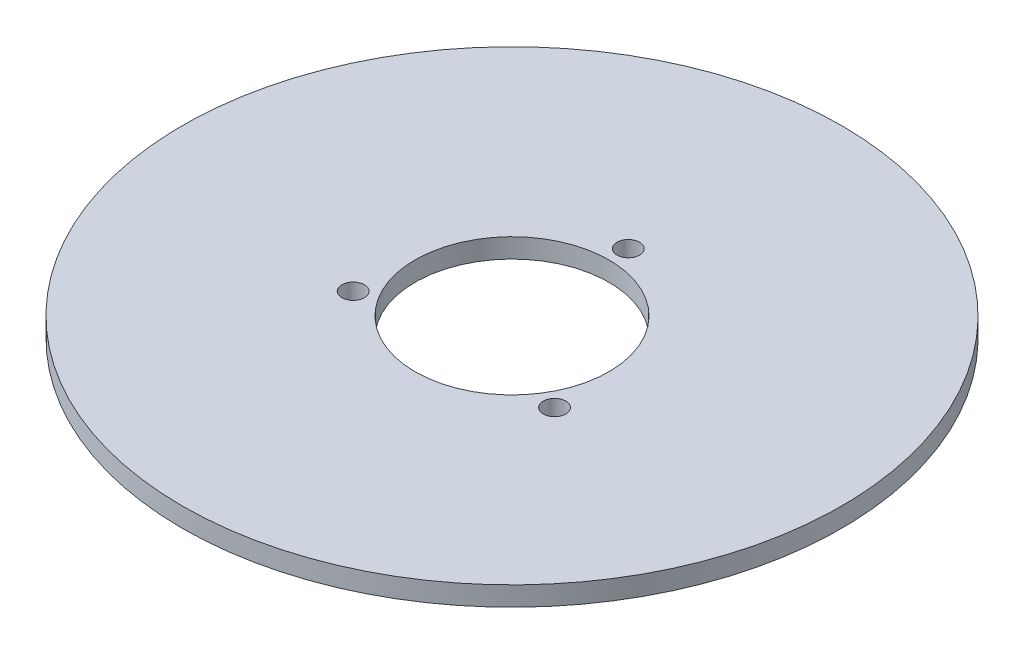
ISO-10303-21;
HEADER;
FILE_DESCRIPTION(('STEP AP214'),'2;1');
FILE_NAME('part.step','',(''),(''),'','','');
FILE_SCHEMA(('AUTOMOTIVE_DESIGN { 1 0 10303 214 1 1 1 1 }'));
ENDSEC;
DATA;
#1=APPLICATION_CONTEXT('core data for automotive mechanical design processes');
#2=APPLICATION_PROTOCOL_DEFINITION('international standard','automotive_design',2000,#1);
#3=PRODUCT_CONTEXT('',#1,'mechanical');
#4=PRODUCT('Part','Part','',(#3));
#5=PRODUCT_RELATED_PRODUCT_CATEGORY('part','',(#4));
#6=PRODUCT_DEFINITION_FORMATION('','',#4);
#7=PRODUCT_DEFINITION_CONTEXT('part definition',#1,'design');
#8=PRODUCT_DEFINITION('design','',#6,#7);
#9=PRODUCT_DEFINITION_SHAPE('','',#8);
#10=(LENGTH_UNIT() NAMED_UNIT(*) SI_UNIT(.MILLI.,.METRE.));
#11=(NAMED_UNIT(*) PLANE_ANGLE_UNIT() SI_UNIT($,.RADIAN.));
#12=(NAMED_UNIT(*) SI_UNIT($,.STERADIAN.) SOLID_ANGLE_UNIT());
#13=UNCERTAINTY_MEASURE_WITH_UNIT(LENGTH_MEASURE(1.E-05),#10,'distance_accuracy_value','');
#14=(GEOMETRIC_REPRESENTATION_CONTEXT(3) GLOBAL_UNCERTAINTY_ASSIGNED_CONTEXT((#13)) GLOBAL_UNIT_ASSIGNED_CONTEXT((#10,
#11,#12)) REPRESENTATION_CONTEXT('',''));
#15=CARTESIAN_POINT('',(0.,0.,0.));
#16=DIRECTION('',(0.,0.,1.));
#17=DIRECTION('',(1.,0.,0.));
#18=AXIS2_PLACEMENT_3D('',#15,#16,#17);
#19=CARTESIAN_POINT('',(0.,5.,0.));
#20=DIRECTION('',(0.,1.,0.));
#21=DIRECTION('',(0.,0.,1.));
#22=AXIS2_PLACEMENT_3D('',#19,#20,#21);
#23=PLANE('',#22);
#24=CARTESIAN_POINT('',(-25.9807621135332,5.,15.));
#25=DIRECTION('',(0.,1.,0.));
#26=DIRECTION('',(0.,0.,1.));
#27=AXIS2_PLACEMENT_3D('',#24,#25,#26);
#28=CIRCLE('',#27,2.9);
#29=CARTESIAN_POINT('',(-25.9807621135332,5.,17.9));
#30=VERTEX_POINT('',#29);
#31=EDGE_CURVE('E62',#30,#30,#28,.T.);
#32=ORIENTED_EDGE('',*,*,#31,.F.);
#33=EDGE_LOOP('',(#32));
#34=FACE_BOUND('',#33,.T.);
#35=CARTESIAN_POINT('',(0.,5.,-30.));
#36=DIRECTION('',(0.,1.,0.));
#37=DIRECTION('',(0.,0.,1.));
#38=AXIS2_PLACEMENT_3D('',#35,#36,#37);
#39=CIRCLE('',#38,2.9);
#40=CARTESIAN_POINT('',(0.,5.,-27.1));
#41=VERTEX_POINT('',#40);
#42=EDGE_CURVE('E51',#41,#41,#39,.T.);
#43=ORIENTED_EDGE('',*,*,#42,.F.);
#44=EDGE_LOOP('',(#43));
#45=FACE_BOUND('',#44,.T.);
#46=CARTESIAN_POINT('',(0.,5.,0.));
#47=DIRECTION('',(0.,1.,0.));
#48=DIRECTION('',(0.,0.,1.));
#49=AXIS2_PLACEMENT_3D('',#46,#47,#48);
#50=CIRCLE('',#49,85.);
#51=CARTESIAN_POINT('',(0.,5.,85.));
#52=VERTEX_POINT('',#51);
#53=EDGE_CURVE('E12',#52,#52,#50,.T.);
#54=ORIENTED_EDGE('',*,*,#53,.T.);
#55=EDGE_LOOP('',(#54));
#56=FACE_BOUND('',#55,.T.);
#57=CARTESIAN_POINT('',(25.9807621135332,5.,15.));
#58=DIRECTION('',(0.,1.,0.));
#59=DIRECTION('',(0.,0.,1.));
#60=AXIS2_PLACEMENT_3D('',#57,#58,#59);
#61=CIRCLE('',#60,2.9);
#62=CARTESIAN_POINT('',(25.9807621135332,5.,17.9));
#63=VERTEX_POINT('',#62);
#64=EDGE_CURVE('E56',#63,#63,#61,.T.);
#65=ORIENTED_EDGE('',*,*,#64,.F.);
#66=EDGE_LOOP('',(#65));
#67=FACE_BOUND('',#66,.T.);
#68=CARTESIAN_POINT('',(0.,5.,0.));
#69=DIRECTION('',(0.,1.,0.));
#70=DIRECTION('',(0.,0.,1.));
#71=AXIS2_PLACEMENT_3D('',#68,#69,#70);
#72=CIRCLE('',#71,25.);
#73=CARTESIAN_POINT('',(0.,5.,25.));
#74=VERTEX_POINT('',#73);
#75=EDGE_CURVE('E68',#74,#74,#72,.T.);
#76=ORIENTED_EDGE('',*,*,#75,.F.);
#77=EDGE_LOOP('',(#76));
#78=FACE_BOUND('',#77,.T.);
#79=ADVANCED_FACE('F40',(#34,#45,#56,#67,#78),#23,.T.);
#80=CARTESIAN_POINT('',(0.,0.,0.));
#81=DIRECTION('',(0.,1.,0.));
#82=DIRECTION('',(0.,0.,1.));
#83=AXIS2_PLACEMENT_3D('',#80,#81,#82);
#84=PLANE('',#83);
#85=CARTESIAN_POINT('',(0.,0.,0.));
#86=DIRECTION('',(0.,1.,0.));
#87=DIRECTION('',(0.,0.,1.));
#88=AXIS2_PLACEMENT_3D('',#85,#86,#87);
#89=CIRCLE('',#88,85.);
#90=CARTESIAN_POINT('',(0.,0.,85.));
#91=VERTEX_POINT('',#90);
#92=EDGE_CURVE('E44',#91,#91,#89,.T.);
#93=ORIENTED_EDGE('',*,*,#92,.F.);
#94=EDGE_LOOP('',(#93));
#95=FACE_BOUND('',#94,.T.);
#96=CARTESIAN_POINT('',(0.,0.,-30.));
#97=DIRECTION('',(0.,1.,0.));
#98=DIRECTION('',(0.,0.,1.));
#99=AXIS2_PLACEMENT_3D('',#96,#97,#98);
#100=CIRCLE('',#99,2.9);
#101=CARTESIAN_POINT('',(0.,0.,-27.1));
#102=VERTEX_POINT('',#101);
#103=EDGE_CURVE('E53',#102,#102,#100,.T.);
#104=ORIENTED_EDGE('',*,*,#103,.T.);
#105=EDGE_LOOP('',(#104));
#106=FACE_BOUND('',#105,.T.);
#107=CARTESIAN_POINT('',(25.9807621135332,0.,15.));
#108=DIRECTION('',(0.,1.,0.));
#109=DIRECTION('',(0.,0.,1.));
#110=AXIS2_PLACEMENT_3D('',#107,#108,#109);
#111=CIRCLE('',#110,2.9);
#112=CARTESIAN_POINT('',(25.9807621135332,0.,17.9));
#113=VERTEX_POINT('',#112);
#114=EDGE_CURVE('E59',#113,#113,#111,.T.);
#115=ORIENTED_EDGE('',*,*,#114,.T.);
#116=EDGE_LOOP('',(#115));
#117=FACE_BOUND('',#116,.T.);
#118=CARTESIAN_POINT('',(-25.9807621135332,0.,15.));
#119=DIRECTION('',(0.,1.,0.));
#120=DIRECTION('',(0.,0.,1.));
#121=AXIS2_PLACEMENT_3D('',#118,#119,#120);
#122=CIRCLE('',#121,2.9);
#123=CARTESIAN_POINT('',(-25.9807621135332,0.,17.9));
#124=VERTEX_POINT('',#123);
#125=EDGE_CURVE('E65',#124,#124,#122,.T.);
#126=ORIENTED_EDGE('',*,*,#125,.T.);
#127=EDGE_LOOP('',(#126));
#128=FACE_BOUND('',#127,.T.);
#129=CARTESIAN_POINT('',(0.,0.,0.));
#130=DIRECTION('',(0.,1.,0.));
#131=DIRECTION('',(0.,0.,1.));
#132=AXIS2_PLACEMENT_3D('',#129,#130,#131);
#133=CIRCLE('',#132,25.);
#134=CARTESIAN_POINT('',(0.,0.,25.));
#135=VERTEX_POINT('',#134);
#136=EDGE_CURVE('E71',#135,#135,#133,.T.);
#137=ORIENTED_EDGE('',*,*,#136,.T.);
#138=EDGE_LOOP('',(#137));
#139=FACE_BOUND('',#138,.T.);
#140=ADVANCED_FACE('F81',(#95,#106,#117,#128,#139),#84,.F.);
#141=CARTESIAN_POINT('',(0.,5.,0.));
#142=DIRECTION('',(0.,-1.,0.));
#143=DIRECTION('',(0.,0.,-1.));
#144=AXIS2_PLACEMENT_3D('',#141,#142,#143);
#145=CYLINDRICAL_SURFACE('',#144,85.);
#146=ORIENTED_EDGE('',*,*,#53,.F.);
#147=EDGE_LOOP('',(#146));
#148=FACE_BOUND('',#147,.T.);
#149=ORIENTED_EDGE('',*,*,#92,.T.);
#150=EDGE_LOOP('',(#149));
#151=FACE_BOUND('',#150,.T.);
#152=ADVANCED_FACE('F42',(#148,#151),#145,.T.);
#153=CARTESIAN_POINT('',(0.,5.,-30.));
#154=DIRECTION('',(0.,-1.,0.));
#155=DIRECTION('',(0.,0.,-1.));
#156=AXIS2_PLACEMENT_3D('',#153,#154,#155);
#157=CYLINDRICAL_SURFACE('',#156,2.9);
#158=ORIENTED_EDGE('',*,*,#42,.T.);
#159=EDGE_LOOP('',(#158));
#160=FACE_BOUND('',#159,.T.);
#161=ORIENTED_EDGE('',*,*,#103,.F.);
#162=EDGE_LOOP('',(#161));
#163=FACE_BOUND('',#162,.T.);
#164=ADVANCED_FACE('F91',(#160,#163),#157,.F.);
#165=CARTESIAN_POINT('',(25.9807621135332,5.,15.));
#166=DIRECTION('',(0.,-1.,0.));
#167=DIRECTION('',(0.,0.,-1.));
#168=AXIS2_PLACEMENT_3D('',#165,#166,#167);
#169=CYLINDRICAL_SURFACE('',#168,2.9);
#170=ORIENTED_EDGE('',*,*,#64,.T.);
#171=EDGE_LOOP('',(#170));
#172=FACE_BOUND('',#171,.T.);
#173=ORIENTED_EDGE('',*,*,#114,.F.);
#174=EDGE_LOOP('',(#173));
#175=FACE_BOUND('',#174,.T.);
#176=ADVANCED_FACE('F94',(#172,#175),#169,.F.);
#177=CARTESIAN_POINT('',(-25.9807621135332,5.,15.));
#178=DIRECTION('',(0.,-1.,0.));
#179=DIRECTION('',(0.,0.,-1.));
#180=AXIS2_PLACEMENT_3D('',#177,#178,#179);
#181=CYLINDRICAL_SURFACE('',#180,2.9);
#182=ORIENTED_EDGE('',*,*,#31,.T.);
#183=EDGE_LOOP('',(#182));
#184=FACE_BOUND('',#183,.T.);
#185=ORIENTED_EDGE('',*,*,#125,.F.);
#186=EDGE_LOOP('',(#185));
#187=FACE_BOUND('',#186,.T.);
#188=ADVANCED_FACE('F98',(#184,#187),#181,.F.);
#189=CARTESIAN_POINT('',(0.,5.,0.));
#190=DIRECTION('',(0.,-1.,0.));
#191=DIRECTION('',(0.,0.,-1.));
#192=AXIS2_PLACEMENT_3D('',#189,#190,#191);
#193=CYLINDRICAL_SURFACE('',#192,25.);
#194=ORIENTED_EDGE('',*,*,#75,.T.);
#195=EDGE_LOOP('',(#194));
#196=FACE_BOUND('',#195,.T.);
#197=ORIENTED_EDGE('',*,*,#136,.F.);
#198=EDGE_LOOP('',(#197));
#199=FACE_BOUND('',#198,.T.);
#200=ADVANCED_FACE('F77',(#196,#199),#193,.F.);
#201=CLOSED_SHELL('',(#79,#140,#152,#164,#176,#188,#200));
#202=MANIFOLD_SOLID_BREP('B2',#201);
#203=ADVANCED_BREP_SHAPE_REPRESENTATION('',(#18,#202),#14);
#204=SHAPE_DEFINITION_REPRESENTATION(#9,#203);
ENDSEC;
END-ISO-10303-21;
